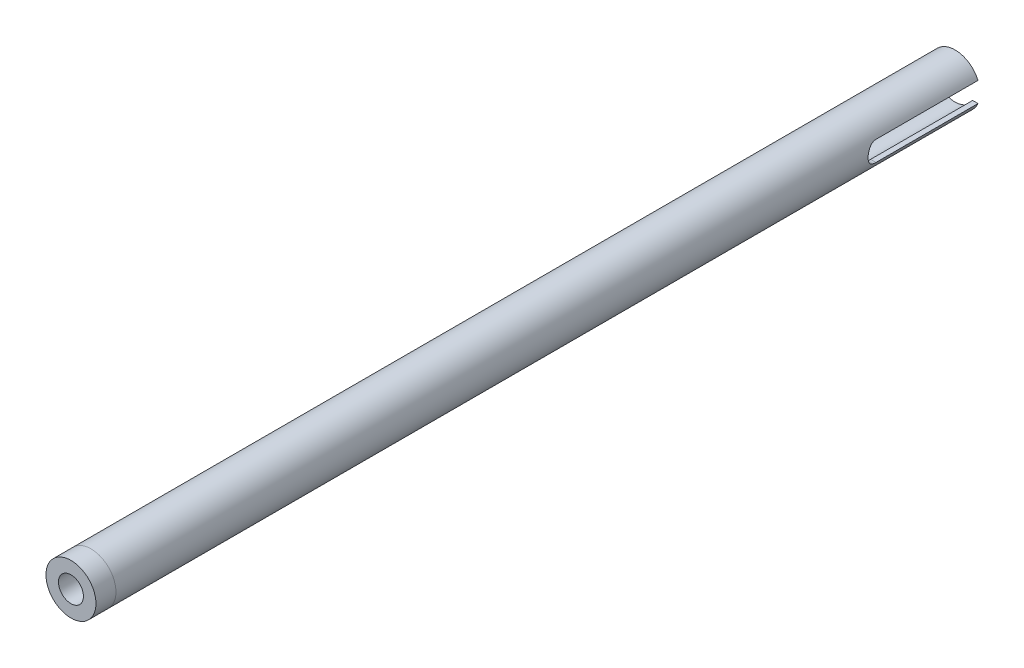
ISO-10303-21;
HEADER;
FILE_DESCRIPTION(('STEP AP214'),'2;1');
FILE_NAME('part.step','',(''),(''),'','','');
FILE_SCHEMA(('AUTOMOTIVE_DESIGN { 1 0 10303 214 1 1 1 1 }'));
ENDSEC;
DATA;
#1=APPLICATION_CONTEXT('core data for automotive mechanical design processes');
#2=APPLICATION_PROTOCOL_DEFINITION('international standard','automotive_design',2000,#1);
#3=PRODUCT_CONTEXT('',#1,'mechanical');
#4=PRODUCT('Part','Part','',(#3));
#5=PRODUCT_RELATED_PRODUCT_CATEGORY('part','',(#4));
#6=PRODUCT_DEFINITION_FORMATION('','',#4);
#7=PRODUCT_DEFINITION_CONTEXT('part definition',#1,'design');
#8=PRODUCT_DEFINITION('design','',#6,#7);
#9=PRODUCT_DEFINITION_SHAPE('','',#8);
#10=(LENGTH_UNIT() NAMED_UNIT(*) SI_UNIT(.MILLI.,.METRE.));
#11=(NAMED_UNIT(*) PLANE_ANGLE_UNIT() SI_UNIT($,.RADIAN.));
#12=(NAMED_UNIT(*) SI_UNIT($,.STERADIAN.) SOLID_ANGLE_UNIT());
#13=UNCERTAINTY_MEASURE_WITH_UNIT(LENGTH_MEASURE(1.E-05),#10,'distance_accuracy_value','');
#14=(GEOMETRIC_REPRESENTATION_CONTEXT(3) GLOBAL_UNCERTAINTY_ASSIGNED_CONTEXT((#13)) GLOBAL_UNIT_ASSIGNED_CONTEXT((#10,
#11,#12)) REPRESENTATION_CONTEXT('',''));
#15=CARTESIAN_POINT('',(0.,0.,0.));
#16=DIRECTION('',(0.,0.,1.));
#17=DIRECTION('',(1.,0.,0.));
#18=AXIS2_PLACEMENT_3D('',#15,#16,#17);
#19=CARTESIAN_POINT('',(0.,0.,-280.732176570716));
#20=DIRECTION('',(0.,0.,1.));
#21=DIRECTION('',(1.,0.,0.));
#22=AXIS2_PLACEMENT_3D('',#19,#20,#21);
#23=CYLINDRICAL_SURFACE('',#22,7.9375);
#24=CARTESIAN_POINT('',(0.,0.,-6.35));
#25=DIRECTION('',(0.,0.,1.));
#26=DIRECTION('',(1.,0.,0.));
#27=AXIS2_PLACEMENT_3D('',#24,#25,#26);
#28=CIRCLE('',#27,7.9375);
#29=CARTESIAN_POINT('',(7.9375,0.,-6.35));
#30=VERTEX_POINT('',#29);
#31=EDGE_CURVE('E165',#30,#30,#28,.T.);
#32=ORIENTED_EDGE('',*,*,#31,.F.);
#33=EDGE_LOOP('',(#32));
#34=FACE_BOUND('',#33,.T.);
#35=CARTESIAN_POINT('',(-7.2748389157424,3.175,-248.347176570716));
#36=CARTESIAN_POINT('',(-7.27482137043434,3.17501267173453,-248.261756455234));
#37=CARTESIAN_POINT('',(-7.27634297592672,3.17155313247793,-248.176345925671));
#38=CARTESIAN_POINT('',(-7.28233338484875,3.15778866907725,-248.006213921343));
#39=CARTESIAN_POINT('',(-7.28680106535325,3.14748635311323,-247.921492196484));
#40=CARTESIAN_POINT('',(-7.29852916312671,3.12019002880163,-247.753678496675));
#41=CARTESIAN_POINT('',(-7.30577831906487,3.10322299732752,-247.670581351916));
#42=CARTESIAN_POINT('',(-7.32282161153745,3.06278779397034,-247.50627024989));
#43=CARTESIAN_POINT('',(-7.33261590324725,3.03931922568673,-247.425056407777));
#44=CARTESIAN_POINT('',(-7.36535331460444,2.9595292434296,-247.185231585194));
#45=CARTESIAN_POINT('',(-7.3916759567784,2.89376893609236,-247.030106656391));
#46=CARTESIAN_POINT('',(-7.45033259991548,2.73920602658921,-246.733019229679));
#47=CARTESIAN_POINT('',(-7.48267254395243,2.65038060922871,-246.591069954462));
#48=CARTESIAN_POINT('',(-7.55175295441386,2.44684429809695,-246.316349184942));
#49=CARTESIAN_POINT('',(-7.58863404630154,2.33103943595689,-246.18442180043));
#50=CARTESIAN_POINT('',(-7.66147718953598,2.07914562663536,-245.941258916798));
#51=CARTESIAN_POINT('',(-7.69743902899202,1.94305205135847,-245.830028151871));
#52=CARTESIAN_POINT('',(-7.76611692840652,1.64778282664418,-245.627106952375));
#53=CARTESIAN_POINT('',(-7.79864638434713,1.48790317306355,-245.536372540971));
#54=CARTESIAN_POINT('',(-7.85502980346525,1.15369615984562,-245.383514987554));
#55=CARTESIAN_POINT('',(-7.87889360585224,0.979385463602713,-245.321359374936));
#56=CARTESIAN_POINT('',(-7.91022225039827,0.670405323433344,-245.24084773128));
#57=CARTESIAN_POINT('',(-7.92038443902171,0.537888188660429,-245.215169807871));
#58=CARTESIAN_POINT('',(-7.93061686811603,0.337231082382099,-245.189414724789));
#59=CARTESIAN_POINT('',(-7.93319257341971,0.269991647180292,-245.182956627509));
#60=CARTESIAN_POINT('',(-7.93663621925193,0.135173873369592,-245.174335609757));
#61=CARTESIAN_POINT('',(-7.93750363389236,0.067595436817584,-245.172174011939));
#62=CARTESIAN_POINT('',(-7.9375,0.,-245.172176570716));
#63=B_SPLINE_CURVE_WITH_KNOTS('',3,(#35,#36,#37,#38,#39,#40,#41,#42,#43,#44,#45,#46,#47,#48,#49,
#50,#51,#52,#53,#54,#55,#56,#57,#58,#59,#60,#61,#62),.UNSPECIFIED.,.F.,.F.,(4,2,2,2,2,2,2,2,2,2,
2,2,2,4),(0.,0.25616079739664,0.512224013007086,0.767261264672294,1.02231406945474,
1.53142416248601,2.041039780479,2.57679273649399,3.11266809162684,3.66991136029743,
4.22651992730647,4.63134321412667,4.83399375866621,5.03670667834028),.UNSPECIFIED.);
#64=CARTESIAN_POINT('',(-7.2748389157424,3.175,-248.347176570716));
#65=VERTEX_POINT('',#64);
#66=CARTESIAN_POINT('',(-7.9375,0.,-245.172176570716));
#67=VERTEX_POINT('',#66);
#68=EDGE_CURVE('E192',#65,#67,#63,.T.);
#69=ORIENTED_EDGE('',*,*,#68,.T.);
#70=CARTESIAN_POINT('',(-7.9375,0.,-245.172176570716));
#71=CARTESIAN_POINT('',(-7.93751279435796,-0.0856973243893161,-245.172164540547));
#72=CARTESIAN_POINT('',(-7.93611246860092,-0.171386675169289,-245.175645908019));
#73=CARTESIAN_POINT('',(-7.93058107051394,-0.342092796869087,-245.189502003354));
#74=CARTESIAN_POINT('',(-7.92645080745519,-0.427109759557717,-245.199874688337));
#75=CARTESIAN_POINT('',(-7.91557399086504,-0.595570690948318,-245.227371882404));
#76=CARTESIAN_POINT('',(-7.90883664469869,-0.679019123580009,-245.244472633677));
#77=CARTESIAN_POINT('',(-7.89293284658536,-0.844038966454647,-245.285239881151));
#78=CARTESIAN_POINT('',(-7.88376629739099,-0.925610301410308,-245.308906640207));
#79=CARTESIAN_POINT('',(-7.8529700783248,-1.16656173687589,-245.389414295906));
#80=CARTESIAN_POINT('',(-7.82802544143957,-1.32244720282991,-245.455806928783));
#81=CARTESIAN_POINT('',(-7.77174407779742,-1.6208190257289,-245.611852332776));
#82=CARTESIAN_POINT('',(-7.74040257287306,-1.76329524966532,-245.701522504839));
#83=CARTESIAN_POINT('',(-7.67287736621953,-2.03755465224645,-245.905976112354));
#84=CARTESIAN_POINT('',(-7.63654472176442,-2.16862853615059,-246.021662969086));
#85=CARTESIAN_POINT('',(-7.56380976030912,-2.41011022612819,-246.272957070795));
#86=CARTESIAN_POINT('',(-7.52740741976911,-2.52050895891189,-246.408573015277));
#87=CARTESIAN_POINT('',(-7.45683282624283,-2.72240939900244,-246.703271510144));
#88=CARTESIAN_POINT('',(-7.42283467350379,-2.81283701743192,-246.863135500059));
#89=CARTESIAN_POINT('',(-7.36333622196319,-2.9651189416839,-247.197261464855));
#90=CARTESIAN_POINT('',(-7.33782422493328,-3.02701262758154,-247.371503202615));
#91=CARTESIAN_POINT('',(-7.30424985403508,-3.10695047193343,-247.679806927266));
#92=CARTESIAN_POINT('',(-7.29331360019112,-3.13238569878911,-247.811665688152));
#93=CARTESIAN_POINT('',(-7.2822797767429,-3.15790858319002,-248.011382569846));
#94=CARTESIAN_POINT('',(-7.27949685702346,-3.16431127275807,-248.078330860606));
#95=CARTESIAN_POINT('',(-7.27577355567174,-3.17285909036155,-248.212572418472));
#96=CARTESIAN_POINT('',(-7.27483380475762,-3.17500276099679,-248.27986579577));
#97=CARTESIAN_POINT('',(-7.2748389157424,-3.175,-248.347176570716));
#98=B_SPLINE_CURVE_WITH_KNOTS('',3,(#70,#71,#72,#73,#74,#75,#76,#77,#78,#79,#80,#81,#82,#83,#84,
#85,#86,#87,#88,#89,#90,#91,#92,#93,#94,#95,#96,#97),.UNSPECIFIED.,.F.,.F.,(4,2,2,2,2,2,2,2,2,2,
2,2,2,4),(0.,0.256996432008006,0.513916713336977,0.769937797705395,1.02596913282158,
1.53722547809955,2.04886511530061,2.58219314099272,3.115754672018,3.67332953074265,
4.23013255190376,4.63306130520187,4.83485003827449,5.03670780985621),.UNSPECIFIED.);
#99=CARTESIAN_POINT('',(-7.2748389157424,-3.175,-248.347176570716));
#100=VERTEX_POINT('',#99);
#101=EDGE_CURVE('E144',#67,#100,#98,.T.);
#102=ORIENTED_EDGE('',*,*,#101,.T.);
#103=DIRECTION('',(0.,0.,-1.));
#104=VECTOR('',#103,1.);
#105=CARTESIAN_POINT('',(-7.2748389157424,-3.175,-245.172176570716));
#106=LINE('',#105,#104);
#107=CARTESIAN_POINT('',(-7.2748389157424,-3.175,-280.732176570716));
#108=VERTEX_POINT('',#107);
#109=EDGE_CURVE('E139',#100,#108,#106,.T.);
#110=ORIENTED_EDGE('',*,*,#109,.T.);
#111=CARTESIAN_POINT('',(0.,0.,-280.732176570716));
#112=DIRECTION('',(0.,0.,1.));
#113=DIRECTION('',(1.,0.,0.));
#114=AXIS2_PLACEMENT_3D('',#111,#112,#113);
#115=CIRCLE('',#114,7.9375);
#116=CARTESIAN_POINT('',(7.2748389157424,-3.175,-280.732176570716));
#117=VERTEX_POINT('',#116);
#118=EDGE_CURVE('E142',#108,#117,#115,.T.);
#119=ORIENTED_EDGE('',*,*,#118,.T.);
#120=DIRECTION('',(0.,0.,-1.));
#121=VECTOR('',#120,1.);
#122=CARTESIAN_POINT('',(7.2748389157424,-3.175,-245.172176570716));
#123=LINE('',#122,#121);
#124=CARTESIAN_POINT('',(7.2748389157424,-3.175,-248.347176570716));
#125=VERTEX_POINT('',#124);
#126=EDGE_CURVE('E425',#125,#117,#123,.T.);
#127=ORIENTED_EDGE('',*,*,#126,.F.);
#128=CARTESIAN_POINT('',(7.2748389157424,-3.175,-248.347176570716));
#129=CARTESIAN_POINT('',(7.27482137043434,-3.17501267173453,-248.261756455234));
#130=CARTESIAN_POINT('',(7.27634297592672,-3.17155313247793,-248.176345925671));
#131=CARTESIAN_POINT('',(7.28233338484875,-3.15778866907725,-248.006213921343));
#132=CARTESIAN_POINT('',(7.28680106535325,-3.14748635311323,-247.921492196484));
#133=CARTESIAN_POINT('',(7.29852916312671,-3.12019002880163,-247.753678496675));
#134=CARTESIAN_POINT('',(7.30577831906487,-3.10322299732752,-247.670581351916));
#135=CARTESIAN_POINT('',(7.32282161153745,-3.06278779397034,-247.50627024989));
#136=CARTESIAN_POINT('',(7.33261590324725,-3.03931922568673,-247.425056407777));
#137=CARTESIAN_POINT('',(7.36535331460444,-2.9595292434296,-247.185231585194));
#138=CARTESIAN_POINT('',(7.3916759567784,-2.89376893609236,-247.030106656391));
#139=CARTESIAN_POINT('',(7.45033259991548,-2.73920602658921,-246.733019229679));
#140=CARTESIAN_POINT('',(7.48267254395243,-2.65038060922871,-246.591069954462));
#141=CARTESIAN_POINT('',(7.55175295441386,-2.44684429809695,-246.316349184942));
#142=CARTESIAN_POINT('',(7.58863404630154,-2.33103943595689,-246.18442180043));
#143=CARTESIAN_POINT('',(7.66147718953598,-2.07914562663536,-245.941258916798));
#144=CARTESIAN_POINT('',(7.69743902899202,-1.94305205135847,-245.830028151871));
#145=CARTESIAN_POINT('',(7.76611692840652,-1.64778282664418,-245.627106952375));
#146=CARTESIAN_POINT('',(7.79864638434713,-1.48790317306355,-245.536372540971));
#147=CARTESIAN_POINT('',(7.85502980346525,-1.15369615984562,-245.383514987554));
#148=CARTESIAN_POINT('',(7.87889360585224,-0.979385463602713,-245.321359374936));
#149=CARTESIAN_POINT('',(7.91022225039827,-0.670405323433344,-245.24084773128));
#150=CARTESIAN_POINT('',(7.92038443902171,-0.537888188660429,-245.215169807871));
#151=CARTESIAN_POINT('',(7.93061686811603,-0.337231082382099,-245.189414724789));
#152=CARTESIAN_POINT('',(7.93319257341971,-0.269991647180292,-245.182956627509));
#153=CARTESIAN_POINT('',(7.93663621925193,-0.135173873369592,-245.174335609757));
#154=CARTESIAN_POINT('',(7.93750363389236,-0.067595436817584,-245.172174011939));
#155=CARTESIAN_POINT('',(7.9375,0.,-245.172176570716));
#156=B_SPLINE_CURVE_WITH_KNOTS('',3,(#128,#129,#130,#131,#132,#133,#134,#135,#136,#137,#138,
#139,#140,#141,#142,#143,#144,#145,#146,#147,#148,#149,#150,#151,#152,#153,#154,#155),
.UNSPECIFIED.,.F.,.F.,(4,2,2,2,2,2,2,2,2,2,2,2,2,4),(0.,0.25616079739664,0.512224013007086,
0.767261264672294,1.02231406945474,1.53142416248601,2.041039780479,2.57679273649399,
3.11266809162684,3.66991136029743,4.22651992730647,4.63134321412667,4.83399375866621,
5.03670667834028),.UNSPECIFIED.);
#157=CARTESIAN_POINT('',(7.9375,0.,-245.172176570716));
#158=VERTEX_POINT('',#157);
#159=EDGE_CURVE('E85',#125,#158,#156,.T.);
#160=ORIENTED_EDGE('',*,*,#159,.T.);
#161=CARTESIAN_POINT('',(7.9375,0.,-245.172176570716));
#162=CARTESIAN_POINT('',(7.93751279435796,0.0856973243893161,-245.172164540547));
#163=CARTESIAN_POINT('',(7.93611246860092,0.171386675169289,-245.175645908019));
#164=CARTESIAN_POINT('',(7.93058107051394,0.342092796869087,-245.189502003354));
#165=CARTESIAN_POINT('',(7.92645080745519,0.427109759557717,-245.199874688337));
#166=CARTESIAN_POINT('',(7.91557399086504,0.595570690948318,-245.227371882404));
#167=CARTESIAN_POINT('',(7.90883664469869,0.679019123580009,-245.244472633677));
#168=CARTESIAN_POINT('',(7.89293284658536,0.844038966454647,-245.285239881151));
#169=CARTESIAN_POINT('',(7.88376629739099,0.925610301410308,-245.308906640207));
#170=CARTESIAN_POINT('',(7.8529700783248,1.16656173687589,-245.389414295906));
#171=CARTESIAN_POINT('',(7.82802544143957,1.32244720282991,-245.455806928783));
#172=CARTESIAN_POINT('',(7.77174407779742,1.6208190257289,-245.611852332776));
#173=CARTESIAN_POINT('',(7.74040257287306,1.76329524966532,-245.701522504839));
#174=CARTESIAN_POINT('',(7.67287736621953,2.03755465224645,-245.905976112354));
#175=CARTESIAN_POINT('',(7.63654472176442,2.16862853615059,-246.021662969086));
#176=CARTESIAN_POINT('',(7.56380976030912,2.41011022612819,-246.272957070795));
#177=CARTESIAN_POINT('',(7.52740741976911,2.52050895891189,-246.408573015277));
#178=CARTESIAN_POINT('',(7.45683282624283,2.72240939900244,-246.703271510144));
#179=CARTESIAN_POINT('',(7.42283467350379,2.81283701743192,-246.863135500059));
#180=CARTESIAN_POINT('',(7.36333622196319,2.9651189416839,-247.197261464855));
#181=CARTESIAN_POINT('',(7.33782422493328,3.02701262758154,-247.371503202615));
#182=CARTESIAN_POINT('',(7.30424985403508,3.10695047193343,-247.679806927266));
#183=CARTESIAN_POINT('',(7.29331360019112,3.13238569878911,-247.811665688152));
#184=CARTESIAN_POINT('',(7.2822797767429,3.15790858319002,-248.011382569846));
#185=CARTESIAN_POINT('',(7.27949685702346,3.16431127275807,-248.078330860606));
#186=CARTESIAN_POINT('',(7.27577355567174,3.17285909036155,-248.212572418472));
#187=CARTESIAN_POINT('',(7.27483380475762,3.17500276099679,-248.27986579577));
#188=CARTESIAN_POINT('',(7.2748389157424,3.175,-248.347176570716));
#189=B_SPLINE_CURVE_WITH_KNOTS('',3,(#161,#162,#163,#164,#165,#166,#167,#168,#169,#170,#171,
#172,#173,#174,#175,#176,#177,#178,#179,#180,#181,#182,#183,#184,#185,#186,#187,#188),
.UNSPECIFIED.,.F.,.F.,(4,2,2,2,2,2,2,2,2,2,2,2,2,4),(0.,0.256996432008006,0.513916713336977,
0.769937797705395,1.02596913282158,1.53722547809955,2.04886511530061,2.58219314099272,
3.115754672018,3.67332953074265,4.23013255190376,4.63306130520187,4.83485003827449,
5.03670780985621),.UNSPECIFIED.);
#190=CARTESIAN_POINT('',(7.2748389157424,3.175,-248.347176570716));
#191=VERTEX_POINT('',#190);
#192=EDGE_CURVE('E71',#158,#191,#189,.T.);
#193=ORIENTED_EDGE('',*,*,#192,.T.);
#194=DIRECTION('',(0.,0.,-1.));
#195=VECTOR('',#194,1.);
#196=CARTESIAN_POINT('',(7.2748389157424,3.175,-245.172176570716));
#197=LINE('',#196,#195);
#198=CARTESIAN_POINT('',(7.2748389157424,3.175,-280.732176570716));
#199=VERTEX_POINT('',#198);
#200=EDGE_CURVE('E158',#191,#199,#197,.T.);
#201=ORIENTED_EDGE('',*,*,#200,.T.);
#202=CARTESIAN_POINT('',(-7.2748389157424,3.175,-280.732176570716));
#203=VERTEX_POINT('',#202);
#204=EDGE_CURVE('E164',#199,#203,#115,.T.);
#205=ORIENTED_EDGE('',*,*,#204,.T.);
#206=DIRECTION('',(0.,0.,-1.));
#207=VECTOR('',#206,1.);
#208=CARTESIAN_POINT('',(-7.2748389157424,3.175,-245.172176570716));
#209=LINE('',#208,#207);
#210=EDGE_CURVE('E418',#65,#203,#209,.T.);
#211=ORIENTED_EDGE('',*,*,#210,.F.);
#212=EDGE_LOOP('',(#69,#102,#110,#119,#127,#160,#193,#201,#205,#211));
#213=FACE_BOUND('',#212,.T.);
#214=ADVANCED_FACE('F61',(#34,#213),#23,.T.);
#215=CARTESIAN_POINT('',(0.,0.,-280.732176570716));
#216=DIRECTION('',(0.,0.,1.));
#217=DIRECTION('',(1.,0.,0.));
#218=AXIS2_PLACEMENT_3D('',#215,#216,#217);
#219=PLANE('',#218);
#220=DIRECTION('',(1.,0.,0.));
#221=VECTOR('',#220,1.);
#222=CARTESIAN_POINT('',(0.,-3.175,-280.732176570716));
#223=LINE('',#222,#221);
#224=CARTESIAN_POINT('',(-5.57246419907746,-3.175,-280.732176570716));
#225=VERTEX_POINT('',#224);
#226=EDGE_CURVE('E151',#108,#225,#223,.T.);
#227=ORIENTED_EDGE('',*,*,#226,.T.);
#228=CARTESIAN_POINT('',(0.,0.,-280.732176570716));
#229=DIRECTION('',(0.,0.,1.));
#230=DIRECTION('',(1.,0.,0.));
#231=AXIS2_PLACEMENT_3D('',#228,#229,#230);
#232=CIRCLE('',#231,6.4135);
#233=CARTESIAN_POINT('',(5.57246419907746,-3.175,-280.732176570716));
#234=VERTEX_POINT('',#233);
#235=EDGE_CURVE('E273',#225,#234,#232,.T.);
#236=ORIENTED_EDGE('',*,*,#235,.T.);
#237=DIRECTION('',(1.,0.,0.));
#238=VECTOR('',#237,1.);
#239=CARTESIAN_POINT('',(0.,-3.175,-280.732176570716));
#240=LINE('',#239,#238);
#241=EDGE_CURVE('E163',#234,#117,#240,.T.);
#242=ORIENTED_EDGE('',*,*,#241,.T.);
#243=ORIENTED_EDGE('',*,*,#118,.F.);
#244=EDGE_LOOP('',(#227,#236,#242,#243));
#245=FACE_BOUND('',#244,.T.);
#246=ADVANCED_FACE('F161',(#245),#219,.F.);
#247=CARTESIAN_POINT('',(0.,0.,-280.732176570716));
#248=DIRECTION('',(0.,0.,1.));
#249=DIRECTION('',(1.,0.,0.));
#250=AXIS2_PLACEMENT_3D('',#247,#248,#249);
#251=CYLINDRICAL_SURFACE('',#250,6.4135);
#252=CARTESIAN_POINT('',(0.,0.,-6.35));
#253=DIRECTION('',(0.,0.,1.));
#254=DIRECTION('',(1.,0.,0.));
#255=AXIS2_PLACEMENT_3D('',#252,#253,#254);
#256=CIRCLE('',#255,6.4135);
#257=CARTESIAN_POINT('',(6.4135,0.,-6.35));
#258=VERTEX_POINT('',#257);
#259=EDGE_CURVE('E147',#258,#258,#256,.T.);
#260=ORIENTED_EDGE('',*,*,#259,.T.);
#261=EDGE_LOOP('',(#260));
#262=FACE_BOUND('',#261,.T.);
#263=DIRECTION('',(0.,0.,-1.));
#264=VECTOR('',#263,1.);
#265=CARTESIAN_POINT('',(-5.57246419907746,-3.175,-245.172176570716));
#266=LINE('',#265,#264);
#267=CARTESIAN_POINT('',(-5.57246419907746,-3.175,-248.347176570716));
#268=VERTEX_POINT('',#267);
#269=EDGE_CURVE('E148',#268,#225,#266,.T.);
#270=ORIENTED_EDGE('',*,*,#269,.F.);
#271=CARTESIAN_POINT('',(-5.57246419907746,-3.175,-248.347176570716));
#272=CARTESIAN_POINT('',(-5.57244013006406,-3.17501485930532,-248.263897457678));
#273=CARTESIAN_POINT('',(-5.57433046393328,-3.17172393593588,-248.180631690807));
#274=CARTESIAN_POINT('',(-5.58175879139226,-3.1586474174694,-248.014824105995));
#275=CARTESIAN_POINT('',(-5.58729459414878,-3.14886572313218,-247.932281883394));
#276=CARTESIAN_POINT('',(-5.60179156831921,-3.12299843383607,-247.768985076665));
#277=CARTESIAN_POINT('',(-5.61073298145,-3.10694918790096,-247.688222971751));
#278=CARTESIAN_POINT('',(-5.63171276239417,-3.068756659135,-247.52857905625));
#279=CARTESIAN_POINT('',(-5.64375147558632,-3.04661269666536,-247.44969745643));
#280=CARTESIAN_POINT('',(-5.6838799338154,-2.97148657354666,-247.216964281432));
#281=CARTESIAN_POINT('',(-5.71602843451585,-2.9097324304215,-247.066543784193));
#282=CARTESIAN_POINT('',(-5.78746445334563,-2.76491119647658,-246.778086567365));
#283=CARTESIAN_POINT('',(-5.82676307252431,-2.68181088046088,-246.640069609999));
#284=CARTESIAN_POINT('',(-5.91189137020973,-2.48887418737119,-246.368272525971));
#285=CARTESIAN_POINT('',(-5.95799203211626,-2.37743022169017,-246.235715723519));
#286=CARTESIAN_POINT('',(-6.04933625068999,-2.13433179626949,-245.990248054446));
#287=CARTESIAN_POINT('',(-6.09457954365872,-2.00267122837296,-245.877343147434));
#288=CARTESIAN_POINT('',(-6.18270630442022,-1.71220053093682,-245.667023854981));
#289=CARTESIAN_POINT('',(-6.22523407848511,-1.55216870534976,-245.57113410455));
#290=CARTESIAN_POINT('',(-6.29953728626817,-1.21586879246633,-245.408285208233));
#291=CARTESIAN_POINT('',(-6.33132906884324,-1.03962591706377,-245.34128203019));
#292=CARTESIAN_POINT('',(-6.37455801221378,-0.71941894247625,-245.25141019786));
#293=CARTESIAN_POINT('',(-6.38903678436651,-0.577736145507954,-245.221837483495));
#294=CARTESIAN_POINT('',(-6.40364692368403,-0.362616983152033,-245.192116409181));
#295=CARTESIAN_POINT('',(-6.40733246196224,-0.290370591494073,-245.184648896543));
#296=CARTESIAN_POINT('',(-6.41226237468065,-0.145424356491902,-245.174676007605));
#297=CARTESIAN_POINT('',(-6.41350576158006,-0.0727243416303689,-245.172172638668));
#298=CARTESIAN_POINT('',(-6.4135,0.,-245.172176570716));
#299=B_SPLINE_CURVE_WITH_KNOTS('',3,(#271,#272,#273,#274,#275,#276,#277,#278,#279,#280,#281,
#282,#283,#284,#285,#286,#287,#288,#289,#290,#291,#292,#293,#294,#295,#296,#297,#298),
.UNSPECIFIED.,.F.,.F.,(4,2,2,2,2,2,2,2,2,2,2,2,2,4),(0.,0.249729002226553,0.499308060527525,
0.74746066754666,0.995640957972498,1.49055300136661,1.98624009021396,2.52160227908799,
3.05712653941521,3.62817923327587,4.19835836008503,4.63305000595098,4.85103401853339,
5.06910615989468),.UNSPECIFIED.);
#300=CARTESIAN_POINT('',(-6.4135,0.,-245.172176570716));
#301=VERTEX_POINT('',#300);
#302=EDGE_CURVE('E219',#268,#301,#299,.T.);
#303=ORIENTED_EDGE('',*,*,#302,.T.);
#304=CARTESIAN_POINT('',(-6.4135,0.,-245.172176570716));
#305=CARTESIAN_POINT('',(-6.41351478956106,0.0839162873638162,-245.17216317082));
#306=CARTESIAN_POINT('',(-6.41185341043851,0.167823114288179,-245.175503096867));
#307=CARTESIAN_POINT('',(-6.40528923860734,0.334952536326369,-245.188785537472));
#308=CARTESIAN_POINT('',(-6.40038773102953,0.418175389480092,-245.198725434293));
#309=CARTESIAN_POINT('',(-6.38748331817869,0.582965498785221,-245.225044238811));
#310=CARTESIAN_POINT('',(-6.37949454331383,0.664538541389254,-245.241393814299));
#311=CARTESIAN_POINT('',(-6.36062930478242,0.825821595252371,-245.280332117892));
#312=CARTESIAN_POINT('',(-6.34975266552956,0.905531492908815,-245.302921225373));
#313=CARTESIAN_POINT('',(-6.31319792977547,1.14087800407252,-245.379657788133));
#314=CARTESIAN_POINT('',(-6.28356695572382,1.29306927815056,-245.442829436321));
#315=CARTESIAN_POINT('',(-6.216480326228,1.58455945770356,-245.590980178301));
#316=CARTESIAN_POINT('',(-6.17901685649498,1.72384528592311,-245.67598107008));
#317=CARTESIAN_POINT('',(-6.09713913910646,1.99475482128858,-245.871081208332));
#318=CARTESIAN_POINT('',(-6.05244508581476,2.12544046453043,-245.98236608507));
#319=CARTESIAN_POINT('',(-5.96206469267669,2.36716277188881,-246.224335531235));
#320=CARTESIAN_POINT('',(-5.91637760323869,2.47818397002904,-246.355035223075));
#321=CARTESIAN_POINT('',(-5.82517699615971,2.68591268931948,-246.644081052027));
#322=CARTESIAN_POINT('',(-5.77994318763785,2.78087960507694,-246.803776246607));
#323=CARTESIAN_POINT('',(-5.69959190124919,2.94207442790849,-247.139159523789));
#324=CARTESIAN_POINT('',(-5.66445328320705,3.00836254036258,-247.314813156961));
#325=CARTESIAN_POINT('',(-5.61637168534323,3.09697219420915,-247.633264531354));
#326=CARTESIAN_POINT('',(-5.60011055849822,3.1260622343607,-247.773679134014));
#327=CARTESIAN_POINT('',(-5.58363385282995,3.15533369889112,-247.987056012256));
#328=CARTESIAN_POINT('',(-5.57946041232981,3.16269716900745,-248.058787737138));
#329=CARTESIAN_POINT('',(-5.57386984218861,3.17253394278506,-248.202729677181));
#330=CARTESIAN_POINT('',(-5.57245416126573,3.17500467618403,-248.274940123852));
#331=CARTESIAN_POINT('',(-5.57246419907746,3.175,-248.347176570716));
#332=B_SPLINE_CURVE_WITH_KNOTS('',3,(#304,#305,#306,#307,#308,#309,#310,#311,#312,#313,#314,
#315,#316,#317,#318,#319,#320,#321,#322,#323,#324,#325,#326,#327,#328,#329,#330,#331),
.UNSPECIFIED.,.F.,.F.,(4,2,2,2,2,2,2,2,2,2,2,2,2,4),(0.,0.251650249697327,0.503200747298844,
0.753613280993145,1.00404104361823,1.50387930503277,2.00421864304454,2.53410176460239,
3.06439980342594,3.63519589642624,4.20478783377489,4.63602373673191,4.85251353275901,
5.06911702550462),.UNSPECIFIED.);
#333=CARTESIAN_POINT('',(-5.57246419907746,3.175,-248.347176570716));
#334=VERTEX_POINT('',#333);
#335=EDGE_CURVE('E184',#301,#334,#332,.T.);
#336=ORIENTED_EDGE('',*,*,#335,.T.);
#337=DIRECTION('',(0.,0.,-1.));
#338=VECTOR('',#337,1.);
#339=CARTESIAN_POINT('',(-5.57246419907746,3.175,-245.172176570716));
#340=LINE('',#339,#338);
#341=CARTESIAN_POINT('',(-5.57246419907746,3.175,-280.732176570716));
#342=VERTEX_POINT('',#341);
#343=EDGE_CURVE('E415',#334,#342,#340,.T.);
#344=ORIENTED_EDGE('',*,*,#343,.T.);
#345=CARTESIAN_POINT('',(5.57246419907746,3.175,-280.732176570716));
#346=VERTEX_POINT('',#345);
#347=EDGE_CURVE('E170',#346,#342,#232,.T.);
#348=ORIENTED_EDGE('',*,*,#347,.F.);
#349=DIRECTION('',(0.,0.,-1.));
#350=VECTOR('',#349,1.);
#351=CARTESIAN_POINT('',(5.57246419907746,3.175,-245.172176570716));
#352=LINE('',#351,#350);
#353=CARTESIAN_POINT('',(5.57246419907746,3.175,-248.347176570716));
#354=VERTEX_POINT('',#353);
#355=EDGE_CURVE('E267',#354,#346,#352,.T.);
#356=ORIENTED_EDGE('',*,*,#355,.F.);
#357=CARTESIAN_POINT('',(5.57246419907746,3.175,-248.347176570716));
#358=CARTESIAN_POINT('',(5.57244013006406,3.17501485930532,-248.263897457678));
#359=CARTESIAN_POINT('',(5.57433046393328,3.17172393593588,-248.180631690807));
#360=CARTESIAN_POINT('',(5.58175879139226,3.1586474174694,-248.014824105995));
#361=CARTESIAN_POINT('',(5.58729459414878,3.14886572313218,-247.932281883394));
#362=CARTESIAN_POINT('',(5.60179156831921,3.12299843383607,-247.768985076665));
#363=CARTESIAN_POINT('',(5.61073298145,3.10694918790096,-247.688222971751));
#364=CARTESIAN_POINT('',(5.63171276239417,3.068756659135,-247.52857905625));
#365=CARTESIAN_POINT('',(5.64375147558632,3.04661269666536,-247.44969745643));
#366=CARTESIAN_POINT('',(5.6838799338154,2.97148657354666,-247.216964281432));
#367=CARTESIAN_POINT('',(5.71602843451585,2.9097324304215,-247.066543784193));
#368=CARTESIAN_POINT('',(5.78746445334563,2.76491119647658,-246.778086567365));
#369=CARTESIAN_POINT('',(5.82676307252431,2.68181088046088,-246.640069609999));
#370=CARTESIAN_POINT('',(5.91189137020973,2.48887418737119,-246.368272525971));
#371=CARTESIAN_POINT('',(5.95799203211626,2.37743022169017,-246.235715723519));
#372=CARTESIAN_POINT('',(6.04933625068999,2.13433179626949,-245.990248054446));
#373=CARTESIAN_POINT('',(6.09457954365872,2.00267122837296,-245.877343147434));
#374=CARTESIAN_POINT('',(6.18270630442022,1.71220053093682,-245.667023854981));
#375=CARTESIAN_POINT('',(6.22523407848511,1.55216870534976,-245.57113410455));
#376=CARTESIAN_POINT('',(6.29953728626817,1.21586879246633,-245.408285208233));
#377=CARTESIAN_POINT('',(6.33132906884324,1.03962591706377,-245.34128203019));
#378=CARTESIAN_POINT('',(6.37455801221378,0.71941894247625,-245.25141019786));
#379=CARTESIAN_POINT('',(6.38903678436651,0.577736145507954,-245.221837483495));
#380=CARTESIAN_POINT('',(6.40364692368403,0.362616983152033,-245.192116409181));
#381=CARTESIAN_POINT('',(6.40733246196224,0.290370591494073,-245.184648896543));
#382=CARTESIAN_POINT('',(6.41226237468065,0.145424356491902,-245.174676007605));
#383=CARTESIAN_POINT('',(6.41350576158006,0.0727243416303689,-245.172172638668));
#384=CARTESIAN_POINT('',(6.4135,0.,-245.172176570716));
#385=B_SPLINE_CURVE_WITH_KNOTS('',3,(#357,#358,#359,#360,#361,#362,#363,#364,#365,#366,#367,
#368,#369,#370,#371,#372,#373,#374,#375,#376,#377,#378,#379,#380,#381,#382,#383,#384),
.UNSPECIFIED.,.F.,.F.,(4,2,2,2,2,2,2,2,2,2,2,2,2,4),(0.,0.249729002226553,0.499308060527525,
0.74746066754666,0.995640957972498,1.49055300136661,1.98624009021396,2.52160227908799,
3.05712653941521,3.62817923327587,4.19835836008503,4.63305000595098,4.85103401853339,
5.06910615989468),.UNSPECIFIED.);
#386=CARTESIAN_POINT('',(6.4135,0.,-245.172176570716));
#387=VERTEX_POINT('',#386);
#388=EDGE_CURVE('E13',#354,#387,#385,.T.);
#389=ORIENTED_EDGE('',*,*,#388,.T.);
#390=CARTESIAN_POINT('',(6.4135,0.,-245.172176570716));
#391=CARTESIAN_POINT('',(6.41351478956106,-0.0839162873638162,-245.17216317082));
#392=CARTESIAN_POINT('',(6.41185341043851,-0.167823114288179,-245.175503096867));
#393=CARTESIAN_POINT('',(6.40528923860734,-0.334952536326369,-245.188785537472));
#394=CARTESIAN_POINT('',(6.40038773102953,-0.418175389480092,-245.198725434293));
#395=CARTESIAN_POINT('',(6.38748331817869,-0.582965498785221,-245.225044238811));
#396=CARTESIAN_POINT('',(6.37949454331383,-0.664538541389254,-245.241393814299));
#397=CARTESIAN_POINT('',(6.36062930478242,-0.825821595252371,-245.280332117892));
#398=CARTESIAN_POINT('',(6.34975266552956,-0.905531492908815,-245.302921225373));
#399=CARTESIAN_POINT('',(6.31319792977547,-1.14087800407252,-245.379657788133));
#400=CARTESIAN_POINT('',(6.28356695572382,-1.29306927815056,-245.442829436321));
#401=CARTESIAN_POINT('',(6.216480326228,-1.58455945770356,-245.590980178301));
#402=CARTESIAN_POINT('',(6.17901685649498,-1.72384528592311,-245.67598107008));
#403=CARTESIAN_POINT('',(6.09713913910646,-1.99475482128858,-245.871081208332));
#404=CARTESIAN_POINT('',(6.05244508581476,-2.12544046453043,-245.98236608507));
#405=CARTESIAN_POINT('',(5.96206469267669,-2.36716277188881,-246.224335531235));
#406=CARTESIAN_POINT('',(5.91637760323869,-2.47818397002904,-246.355035223075));
#407=CARTESIAN_POINT('',(5.82517699615971,-2.68591268931948,-246.644081052027));
#408=CARTESIAN_POINT('',(5.77994318763785,-2.78087960507694,-246.803776246607));
#409=CARTESIAN_POINT('',(5.69959190124919,-2.94207442790849,-247.139159523789));
#410=CARTESIAN_POINT('',(5.66445328320705,-3.00836254036258,-247.314813156961));
#411=CARTESIAN_POINT('',(5.61637168534323,-3.09697219420915,-247.633264531354));
#412=CARTESIAN_POINT('',(5.60011055849822,-3.1260622343607,-247.773679134014));
#413=CARTESIAN_POINT('',(5.58363385282995,-3.15533369889112,-247.987056012256));
#414=CARTESIAN_POINT('',(5.57946041232981,-3.16269716900745,-248.058787737138));
#415=CARTESIAN_POINT('',(5.57386984218861,-3.17253394278506,-248.202729677181));
#416=CARTESIAN_POINT('',(5.57245416126573,-3.17500467618403,-248.274940123852));
#417=CARTESIAN_POINT('',(5.57246419907746,-3.175,-248.347176570716));
#418=B_SPLINE_CURVE_WITH_KNOTS('',3,(#390,#391,#392,#393,#394,#395,#396,#397,#398,#399,#400,
#401,#402,#403,#404,#405,#406,#407,#408,#409,#410,#411,#412,#413,#414,#415,#416,#417),
.UNSPECIFIED.,.F.,.F.,(4,2,2,2,2,2,2,2,2,2,2,2,2,4),(0.,0.251650249697327,0.503200747298844,
0.753613280993145,1.00404104361823,1.50387930503277,2.00421864304454,2.53410176460239,
3.06439980342594,3.63519589642624,4.20478783377489,4.63602373673191,4.85251353275901,
5.06911702550462),.UNSPECIFIED.);
#419=CARTESIAN_POINT('',(5.57246419907746,-3.175,-248.347176570716));
#420=VERTEX_POINT('',#419);
#421=EDGE_CURVE('E235',#387,#420,#418,.T.);
#422=ORIENTED_EDGE('',*,*,#421,.T.);
#423=DIRECTION('',(0.,0.,-1.));
#424=VECTOR('',#423,1.);
#425=CARTESIAN_POINT('',(5.57246419907746,-3.175,-245.172176570716));
#426=LINE('',#425,#424);
#427=EDGE_CURVE('E269',#420,#234,#426,.T.);
#428=ORIENTED_EDGE('',*,*,#427,.T.);
#429=ORIENTED_EDGE('',*,*,#235,.F.);
#430=EDGE_LOOP('',(#270,#303,#336,#344,#348,#356,#389,#422,#428,#429));
#431=FACE_BOUND('',#430,.T.);
#432=ADVANCED_FACE('F199',(#262,#431),#251,.F.);
#433=ORIENTED_EDGE('',*,*,#347,.T.);
#434=DIRECTION('',(1.,0.,0.));
#435=VECTOR('',#434,1.);
#436=CARTESIAN_POINT('',(0.,3.175,-280.732176570716));
#437=LINE('',#436,#435);
#438=EDGE_CURVE('E157',#203,#342,#437,.T.);
#439=ORIENTED_EDGE('',*,*,#438,.F.);
#440=ORIENTED_EDGE('',*,*,#204,.F.);
#441=DIRECTION('',(1.,0.,0.));
#442=VECTOR('',#441,1.);
#443=CARTESIAN_POINT('',(0.,3.175,-280.732176570716));
#444=LINE('',#443,#442);
#445=EDGE_CURVE('E251',#346,#199,#444,.T.);
#446=ORIENTED_EDGE('',*,*,#445,.F.);
#447=EDGE_LOOP('',(#433,#439,#440,#446));
#448=FACE_BOUND('',#447,.T.);
#449=ADVANCED_FACE('F284',(#448),#219,.F.);
#450=CARTESIAN_POINT('',(0.,0.,-6.35));
#451=DIRECTION('',(0.,0.,1.));
#452=DIRECTION('',(1.,0.,0.));
#453=AXIS2_PLACEMENT_3D('',#450,#451,#452);
#454=PLANE('',#453);
#455=ORIENTED_EDGE('',*,*,#259,.F.);
#456=EDGE_LOOP('',(#455));
#457=FACE_BOUND('',#456,.T.);
#458=ORIENTED_EDGE('',*,*,#31,.T.);
#459=EDGE_LOOP('',(#458));
#460=FACE_BOUND('',#459,.T.);
#461=ADVANCED_FACE('F281',(#457,#460),#454,.T.);
#462=CARTESIAN_POINT('',(0.,3.175,-245.172176570716));
#463=DIRECTION('',(0.,1.,0.));
#464=DIRECTION('',(0.,0.,1.));
#465=AXIS2_PLACEMENT_3D('',#462,#463,#464);
#466=PLANE('',#465);
#467=ORIENTED_EDGE('',*,*,#200,.F.);
#468=DIRECTION('',(1.,0.,0.));
#469=VECTOR('',#468,1.);
#470=CARTESIAN_POINT('',(5.57246419907746,3.175,-248.347176570716));
#471=LINE('',#470,#469);
#472=EDGE_CURVE('E182',#191,#354,#471,.F.);
#473=ORIENTED_EDGE('',*,*,#472,.T.);
#474=ORIENTED_EDGE('',*,*,#355,.T.);
#475=ORIENTED_EDGE('',*,*,#445,.T.);
#476=EDGE_LOOP('',(#467,#473,#474,#475));
#477=FACE_BOUND('',#476,.T.);
#478=ADVANCED_FACE('F264',(#477),#466,.F.);
#479=CARTESIAN_POINT('',(0.,-3.175,-245.172176570716));
#480=DIRECTION('',(0.,1.,0.));
#481=DIRECTION('',(0.,0.,1.));
#482=AXIS2_PLACEMENT_3D('',#479,#480,#481);
#483=PLANE('',#482);
#484=ORIENTED_EDGE('',*,*,#427,.F.);
#485=DIRECTION('',(1.,0.,0.));
#486=VECTOR('',#485,1.);
#487=CARTESIAN_POINT('',(0.,-3.175,-248.347176570716));
#488=LINE('',#487,#486);
#489=EDGE_CURVE('E179',#420,#125,#488,.T.);
#490=ORIENTED_EDGE('',*,*,#489,.T.);
#491=ORIENTED_EDGE('',*,*,#126,.T.);
#492=ORIENTED_EDGE('',*,*,#241,.F.);
#493=EDGE_LOOP('',(#484,#490,#491,#492));
#494=FACE_BOUND('',#493,.T.);
#495=ADVANCED_FACE('F359',(#494),#483,.T.);
#496=CARTESIAN_POINT('',(0.,-3.175,-245.172176570716));
#497=DIRECTION('',(0.,1.,0.));
#498=DIRECTION('',(0.,0.,1.));
#499=AXIS2_PLACEMENT_3D('',#496,#497,#498);
#500=PLANE('',#499);
#501=ORIENTED_EDGE('',*,*,#109,.F.);
#502=DIRECTION('',(1.,0.,0.));
#503=VECTOR('',#502,1.);
#504=CARTESIAN_POINT('',(0.,-3.175,-248.347176570716));
#505=LINE('',#504,#503);
#506=EDGE_CURVE('E177',#100,#268,#505,.T.);
#507=ORIENTED_EDGE('',*,*,#506,.T.);
#508=ORIENTED_EDGE('',*,*,#269,.T.);
#509=ORIENTED_EDGE('',*,*,#226,.F.);
#510=EDGE_LOOP('',(#501,#507,#508,#509));
#511=FACE_BOUND('',#510,.T.);
#512=ADVANCED_FACE('F152',(#511),#500,.T.);
#513=CARTESIAN_POINT('',(0.,3.175,-245.172176570716));
#514=DIRECTION('',(0.,1.,0.));
#515=DIRECTION('',(0.,0.,1.));
#516=AXIS2_PLACEMENT_3D('',#513,#514,#515);
#517=PLANE('',#516);
#518=ORIENTED_EDGE('',*,*,#343,.F.);
#519=DIRECTION('',(1.,0.,0.));
#520=VECTOR('',#519,1.);
#521=CARTESIAN_POINT('',(-7.2748389157424,3.175,-248.347176570716));
#522=LINE('',#521,#520);
#523=EDGE_CURVE('E168',#334,#65,#522,.F.);
#524=ORIENTED_EDGE('',*,*,#523,.T.);
#525=ORIENTED_EDGE('',*,*,#210,.T.);
#526=ORIENTED_EDGE('',*,*,#438,.T.);
#527=EDGE_LOOP('',(#518,#524,#525,#526));
#528=FACE_BOUND('',#527,.T.);
#529=ADVANCED_FACE('F214',(#528),#517,.F.);
#530=CARTESIAN_POINT('',(0.,0.,-248.347176570716));
#531=DIRECTION('',(1.,0.,0.));
#532=DIRECTION('',(0.,0.,-1.));
#533=AXIS2_PLACEMENT_3D('',#530,#531,#532);
#534=CYLINDRICAL_SURFACE('',#533,3.175);
#535=ORIENTED_EDGE('',*,*,#506,.F.);
#536=ORIENTED_EDGE('',*,*,#101,.F.);
#537=DIRECTION('',(1.,0.,0.));
#538=VECTOR('',#537,1.);
#539=CARTESIAN_POINT('',(0.,0.,-245.172176570716));
#540=LINE('',#539,#538);
#541=EDGE_CURVE('E249',#301,#67,#540,.F.);
#542=ORIENTED_EDGE('',*,*,#541,.F.);
#543=ORIENTED_EDGE('',*,*,#302,.F.);
#544=EDGE_LOOP('',(#535,#536,#542,#543));
#545=FACE_BOUND('',#544,.T.);
#546=ADVANCED_FACE('F207',(#545),#534,.F.);
#547=CARTESIAN_POINT('',(0.,0.,-248.347176570716));
#548=DIRECTION('',(-1.,0.,0.));
#549=DIRECTION('',(0.,0.,1.));
#550=AXIS2_PLACEMENT_3D('',#547,#548,#549);
#551=CYLINDRICAL_SURFACE('',#550,3.175);
#552=ORIENTED_EDGE('',*,*,#68,.F.);
#553=ORIENTED_EDGE('',*,*,#523,.F.);
#554=ORIENTED_EDGE('',*,*,#335,.F.);
#555=ORIENTED_EDGE('',*,*,#541,.T.);
#556=EDGE_LOOP('',(#552,#553,#554,#555));
#557=FACE_BOUND('',#556,.T.);
#558=ADVANCED_FACE('F203',(#557),#551,.F.);
#559=CARTESIAN_POINT('',(0.,0.,-248.347176570716));
#560=DIRECTION('',(-1.,0.,0.));
#561=DIRECTION('',(0.,0.,1.));
#562=AXIS2_PLACEMENT_3D('',#559,#560,#561);
#563=CYLINDRICAL_SURFACE('',#562,3.175);
#564=DIRECTION('',(1.,0.,0.));
#565=VECTOR('',#564,1.);
#566=CARTESIAN_POINT('',(7.2748389157424,0.,-245.172176570716));
#567=LINE('',#566,#565);
#568=EDGE_CURVE('E66',#387,#158,#567,.T.);
#569=ORIENTED_EDGE('',*,*,#568,.F.);
#570=ORIENTED_EDGE('',*,*,#388,.F.);
#571=ORIENTED_EDGE('',*,*,#472,.F.);
#572=ORIENTED_EDGE('',*,*,#192,.F.);
#573=EDGE_LOOP('',(#569,#570,#571,#572));
#574=FACE_BOUND('',#573,.T.);
#575=ADVANCED_FACE('F63',(#574),#563,.F.);
#576=CARTESIAN_POINT('',(0.,0.,-248.347176570716));
#577=DIRECTION('',(1.,0.,0.));
#578=DIRECTION('',(0.,0.,-1.));
#579=AXIS2_PLACEMENT_3D('',#576,#577,#578);
#580=CYLINDRICAL_SURFACE('',#579,3.175);
#581=ORIENTED_EDGE('',*,*,#421,.F.);
#582=ORIENTED_EDGE('',*,*,#568,.T.);
#583=ORIENTED_EDGE('',*,*,#159,.F.);
#584=ORIENTED_EDGE('',*,*,#489,.F.);
#585=EDGE_LOOP('',(#581,#582,#583,#584));
#586=FACE_BOUND('',#585,.T.);
#587=ADVANCED_FACE('F216',(#586),#580,.F.);
#588=CLOSED_SHELL('',(#214,#246,#432,#449,#461,#478,#495,#512,#529,#546,#558,#575,#587));
#589=MANIFOLD_SOLID_BREP('B2',#588);
#590=CARTESIAN_POINT('',(0.,0.,-6.35));
#591=DIRECTION('',(0.,0.,1.));
#592=DIRECTION('',(1.,0.,0.));
#593=AXIS2_PLACEMENT_3D('',#590,#591,#592);
#594=CYLINDRICAL_SURFACE('',#593,7.9375);
#595=CARTESIAN_POINT('',(0.,0.,-6.35));
#596=DIRECTION('',(0.,0.,1.));
#597=DIRECTION('',(1.,0.,0.));
#598=AXIS2_PLACEMENT_3D('',#595,#596,#597);
#599=CIRCLE('',#598,7.9375);
#600=CARTESIAN_POINT('',(7.9375,0.,-6.35));
#601=VERTEX_POINT('',#600);
#602=EDGE_CURVE('E60',#601,#601,#599,.T.);
#603=ORIENTED_EDGE('',*,*,#602,.T.);
#604=EDGE_LOOP('',(#603));
#605=FACE_BOUND('',#604,.T.);
#606=CARTESIAN_POINT('',(0.,0.,0.));
#607=DIRECTION('',(0.,0.,1.));
#608=DIRECTION('',(1.,0.,0.));
#609=AXIS2_PLACEMENT_3D('',#606,#607,#608);
#610=CIRCLE('',#609,7.9375);
#611=CARTESIAN_POINT('',(7.9375,0.,0.));
#612=VERTEX_POINT('',#611);
#613=EDGE_CURVE('E463',#612,#612,#610,.T.);
#614=ORIENTED_EDGE('',*,*,#613,.F.);
#615=EDGE_LOOP('',(#614));
#616=FACE_BOUND('',#615,.T.);
#617=ADVANCED_FACE('F452',(#605,#616),#594,.T.);
#618=CARTESIAN_POINT('',(0.,0.,-6.35));
#619=DIRECTION('',(0.,0.,1.));
#620=DIRECTION('',(1.,0.,0.));
#621=AXIS2_PLACEMENT_3D('',#618,#619,#620);
#622=CYLINDRICAL_SURFACE('',#621,3.96875);
#623=CARTESIAN_POINT('',(0.,0.,0.));
#624=DIRECTION('',(0.,0.,1.));
#625=DIRECTION('',(1.,0.,0.));
#626=AXIS2_PLACEMENT_3D('',#623,#624,#625);
#627=CIRCLE('',#626,3.96875);
#628=CARTESIAN_POINT('',(3.96875,0.,0.));
#629=VERTEX_POINT('',#628);
#630=EDGE_CURVE('E455',#629,#629,#627,.T.);
#631=ORIENTED_EDGE('',*,*,#630,.T.);
#632=EDGE_LOOP('',(#631));
#633=FACE_BOUND('',#632,.T.);
#634=CARTESIAN_POINT('',(0.,0.,-15.875));
#635=DIRECTION('',(0.,0.,1.));
#636=DIRECTION('',(1.,0.,0.));
#637=AXIS2_PLACEMENT_3D('',#634,#635,#636);
#638=CIRCLE('',#637,3.96875);
#639=CARTESIAN_POINT('',(3.96875,0.,-15.875));
#640=VERTEX_POINT('',#639);
#641=EDGE_CURVE('E475',#640,#640,#638,.T.);
#642=ORIENTED_EDGE('',*,*,#641,.F.);
#643=EDGE_LOOP('',(#642));
#644=FACE_BOUND('',#643,.T.);
#645=ADVANCED_FACE('F483',(#633,#644),#622,.F.);
#646=CARTESIAN_POINT('',(0.,0.,-6.35));
#647=DIRECTION('',(0.,0.,1.));
#648=DIRECTION('',(1.,0.,0.));
#649=AXIS2_PLACEMENT_3D('',#646,#647,#648);
#650=PLANE('',#649);
#651=CARTESIAN_POINT('',(0.,0.,-6.35));
#652=DIRECTION('',(0.,0.,1.));
#653=DIRECTION('',(1.,0.,0.));
#654=AXIS2_PLACEMENT_3D('',#651,#652,#653);
#655=CIRCLE('',#654,6.4135);
#656=CARTESIAN_POINT('',(6.4135,0.,-6.35));
#657=VERTEX_POINT('',#656);
#658=EDGE_CURVE('E465',#657,#657,#655,.T.);
#659=ORIENTED_EDGE('',*,*,#658,.T.);
#660=EDGE_LOOP('',(#659));
#661=FACE_BOUND('',#660,.T.);
#662=ORIENTED_EDGE('',*,*,#602,.F.);
#663=EDGE_LOOP('',(#662));
#664=FACE_BOUND('',#663,.T.);
#665=ADVANCED_FACE('F485',(#661,#664),#650,.F.);
#666=CARTESIAN_POINT('',(0.,0.,0.));
#667=DIRECTION('',(0.,0.,1.));
#668=DIRECTION('',(1.,0.,0.));
#669=AXIS2_PLACEMENT_3D('',#666,#667,#668);
#670=PLANE('',#669);
#671=ORIENTED_EDGE('',*,*,#613,.T.);
#672=EDGE_LOOP('',(#671));
#673=FACE_BOUND('',#672,.T.);
#674=ORIENTED_EDGE('',*,*,#630,.F.);
#675=EDGE_LOOP('',(#674));
#676=FACE_BOUND('',#675,.T.);
#677=ADVANCED_FACE('F491',(#673,#676),#670,.T.);
#678=CARTESIAN_POINT('',(0.,0.,-15.875));
#679=DIRECTION('',(0.,0.,1.));
#680=DIRECTION('',(1.,0.,0.));
#681=AXIS2_PLACEMENT_3D('',#678,#679,#680);
#682=CYLINDRICAL_SURFACE('',#681,6.4135);
#683=CARTESIAN_POINT('',(0.,0.,-15.875));
#684=DIRECTION('',(0.,0.,1.));
#685=DIRECTION('',(1.,0.,0.));
#686=AXIS2_PLACEMENT_3D('',#683,#684,#685);
#687=CIRCLE('',#686,6.4135);
#688=CARTESIAN_POINT('',(6.4135,0.,-15.875));
#689=VERTEX_POINT('',#688);
#690=EDGE_CURVE('E468',#689,#689,#687,.T.);
#691=CARTESIAN_POINT('',(6.4135,0.,-15.875));
#692=CARTESIAN_POINT('',(6.4135,0.,-15.77578125));
#693=CARTESIAN_POINT('',(6.4135,0.,-15.6765625));
#694=CARTESIAN_POINT('',(6.4135,0.,-15.478125));
#695=CARTESIAN_POINT('',(6.4135,0.,-15.37890625));
#696=CARTESIAN_POINT('',(6.4135,0.,-15.18046875));
#697=CARTESIAN_POINT('',(6.4135,0.,-15.08125));
#698=CARTESIAN_POINT('',(6.4135,0.,-14.8828125));
#699=CARTESIAN_POINT('',(6.4135,0.,-14.78359375));
#700=CARTESIAN_POINT('',(6.4135,0.,-14.58515625));
#701=CARTESIAN_POINT('',(6.4135,0.,-14.4859375));
#702=CARTESIAN_POINT('',(6.4135,0.,-14.2875));
#703=CARTESIAN_POINT('',(6.4135,0.,-14.18828125));
#704=CARTESIAN_POINT('',(6.4135,0.,-13.98984375));
#705=CARTESIAN_POINT('',(6.4135,0.,-13.890625));
#706=CARTESIAN_POINT('',(6.4135,0.,-13.6921875));
#707=CARTESIAN_POINT('',(6.4135,0.,-13.59296875));
#708=CARTESIAN_POINT('',(6.4135,0.,-13.39453125));
#709=CARTESIAN_POINT('',(6.4135,0.,-13.2953125));
#710=CARTESIAN_POINT('',(6.4135,0.,-13.096875));
#711=CARTESIAN_POINT('',(6.4135,0.,-12.99765625));
#712=CARTESIAN_POINT('',(6.4135,0.,-12.79921875));
#713=CARTESIAN_POINT('',(6.4135,0.,-12.7));
#714=CARTESIAN_POINT('',(6.4135,0.,-12.5015625));
#715=CARTESIAN_POINT('',(6.4135,0.,-12.40234375));
#716=CARTESIAN_POINT('',(6.4135,0.,-12.20390625));
#717=CARTESIAN_POINT('',(6.4135,0.,-12.1046875));
#718=CARTESIAN_POINT('',(6.4135,0.,-11.90625));
#719=CARTESIAN_POINT('',(6.4135,0.,-11.80703125));
#720=CARTESIAN_POINT('',(6.4135,0.,-11.60859375));
#721=CARTESIAN_POINT('',(6.4135,0.,-11.509375));
#722=CARTESIAN_POINT('',(6.4135,0.,-11.3109375));
#723=CARTESIAN_POINT('',(6.4135,0.,-11.21171875));
#724=CARTESIAN_POINT('',(6.4135,0.,-11.01328125));
#725=CARTESIAN_POINT('',(6.4135,0.,-10.9140625));
#726=CARTESIAN_POINT('',(6.4135,0.,-10.715625));
#727=CARTESIAN_POINT('',(6.4135,0.,-10.61640625));
#728=CARTESIAN_POINT('',(6.4135,0.,-10.41796875));
#729=CARTESIAN_POINT('',(6.4135,0.,-10.31875));
#730=CARTESIAN_POINT('',(6.4135,0.,-10.1203125));
#731=CARTESIAN_POINT('',(6.4135,0.,-10.02109375));
#732=CARTESIAN_POINT('',(6.4135,0.,-9.82265625));
#733=CARTESIAN_POINT('',(6.4135,0.,-9.7234375));
#734=CARTESIAN_POINT('',(6.4135,0.,-9.525));
#735=CARTESIAN_POINT('',(6.4135,0.,-9.42578125));
#736=CARTESIAN_POINT('',(6.4135,0.,-9.22734375));
#737=CARTESIAN_POINT('',(6.4135,0.,-9.128125));
#738=CARTESIAN_POINT('',(6.4135,0.,-8.9296875));
#739=CARTESIAN_POINT('',(6.4135,0.,-8.83046875));
#740=CARTESIAN_POINT('',(6.4135,0.,-8.63203125));
#741=CARTESIAN_POINT('',(6.4135,0.,-8.5328125));
#742=CARTESIAN_POINT('',(6.4135,0.,-8.334375));
#743=CARTESIAN_POINT('',(6.4135,0.,-8.23515625));
#744=CARTESIAN_POINT('',(6.4135,0.,-8.03671875));
#745=CARTESIAN_POINT('',(6.4135,0.,-7.9375));
#746=CARTESIAN_POINT('',(6.4135,0.,-7.7390625));
#747=CARTESIAN_POINT('',(6.4135,0.,-7.63984375));
#748=CARTESIAN_POINT('',(6.4135,0.,-7.44140625));
#749=CARTESIAN_POINT('',(6.4135,0.,-7.3421875));
#750=CARTESIAN_POINT('',(6.4135,0.,-7.14375));
#751=CARTESIAN_POINT('',(6.4135,0.,-7.04453125));
#752=CARTESIAN_POINT('',(6.4135,0.,-6.84609375));
#753=CARTESIAN_POINT('',(6.4135,0.,-6.746875));
#754=CARTESIAN_POINT('',(6.4135,0.,-6.5484375));
#755=CARTESIAN_POINT('',(6.4135,0.,-6.44921875));
#756=CARTESIAN_POINT('',(6.4135,0.,-6.35));
#757=B_SPLINE_CURVE_WITH_KNOTS('',3,(#691,#692,#693,#694,#695,#696,#697,#698,#699,#700,#701,
#702,#703,#704,#705,#706,#707,#708,#709,#710,#711,#712,#713,#714,#715,#716,#717,#718,#719,#720,
#721,#722,#723,#724,#725,#726,#727,#728,#729,#730,#731,#732,#733,#734,#735,#736,#737,#738,#739,
#740,#741,#742,#743,#744,#745,#746,#747,#748,#749,#750,#751,#752,#753,#754,#755,#756),
.UNSPECIFIED.,.F.,.F.,(4,2,2,2,2,2,2,2,2,2,2,2,2,2,2,2,2,2,2,2,2,2,2,2,2,2,2,2,2,2,2,2,4),(0.,
0.297656250000002,0.595312500000002,0.892968750000002,1.190625,1.48828125,1.7859375,2.08359375,
2.38125,2.67890625,2.9765625,3.27421875,3.571875,3.86953125,4.1671875,4.46484375,4.7625,
5.06015625,5.3578125,5.65546875,5.953125,6.25078125,6.5484375,6.84609375,7.14375,7.44140625,
7.7390625,8.03671875,8.334375,8.63203125,8.9296875,9.22734375,9.525),.UNSPECIFIED.);
#758=EDGE_CURVE('BSEAM496',#689,#657,#757,.T.);
#759=ORIENTED_EDGE('',*,*,#690,.T.);
#760=ORIENTED_EDGE('',*,*,#658,.F.);
#761=ORIENTED_EDGE('',*,*,#758,.T.);
#762=ORIENTED_EDGE('',*,*,#758,.F.);
#763=EDGE_LOOP('',(#759,#761,#760,#762));
#764=FACE_BOUND('',#763,.T.);
#765=ADVANCED_FACE('F496',(#764),#682,.T.);
#766=CARTESIAN_POINT('',(0.,0.,-15.875));
#767=DIRECTION('',(0.,0.,1.));
#768=DIRECTION('',(1.,0.,0.));
#769=AXIS2_PLACEMENT_3D('',#766,#767,#768);
#770=PLANE('',#769);
#771=ORIENTED_EDGE('',*,*,#641,.T.);
#772=EDGE_LOOP('',(#771));
#773=FACE_BOUND('',#772,.T.);
#774=ORIENTED_EDGE('',*,*,#690,.F.);
#775=EDGE_LOOP('',(#774));
#776=FACE_BOUND('',#775,.T.);
#777=ADVANCED_FACE('F480',(#773,#776),#770,.F.);
#778=CLOSED_SHELL('',(#617,#645,#665,#677,#765,#777));
#779=MANIFOLD_SOLID_BREP('B7',#778);
#780=ADVANCED_BREP_SHAPE_REPRESENTATION('',(#18,#589,#779),#14);
#781=SHAPE_DEFINITION_REPRESENTATION(#9,#780);
ENDSEC;
END-ISO-10303-21;
